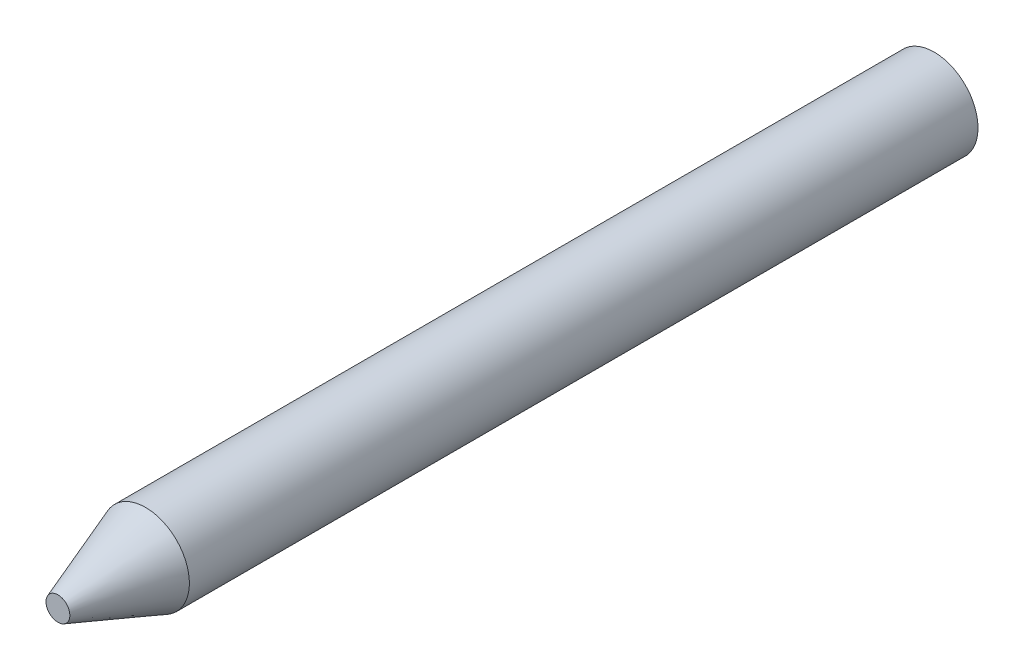
ISO-10303-21;
HEADER;
FILE_DESCRIPTION(('STEP AP214'),'2;1');
FILE_NAME('part.step','',(''),(''),'','','');
FILE_SCHEMA(('AUTOMOTIVE_DESIGN { 1 0 10303 214 1 1 1 1 }'));
ENDSEC;
DATA;
#1=APPLICATION_CONTEXT('core data for automotive mechanical design processes');
#2=APPLICATION_PROTOCOL_DEFINITION('international standard','automotive_design',2000,#1);
#3=PRODUCT_CONTEXT('',#1,'mechanical');
#4=PRODUCT('Part','Part','',(#3));
#5=PRODUCT_RELATED_PRODUCT_CATEGORY('part','',(#4));
#6=PRODUCT_DEFINITION_FORMATION('','',#4);
#7=PRODUCT_DEFINITION_CONTEXT('part definition',#1,'design');
#8=PRODUCT_DEFINITION('design','',#6,#7);
#9=PRODUCT_DEFINITION_SHAPE('','',#8);
#10=(LENGTH_UNIT() NAMED_UNIT(*) SI_UNIT(.MILLI.,.METRE.));
#11=(NAMED_UNIT(*) PLANE_ANGLE_UNIT() SI_UNIT($,.RADIAN.));
#12=(NAMED_UNIT(*) SI_UNIT($,.STERADIAN.) SOLID_ANGLE_UNIT());
#13=UNCERTAINTY_MEASURE_WITH_UNIT(LENGTH_MEASURE(1.E-05),#10,'distance_accuracy_value','');
#14=(GEOMETRIC_REPRESENTATION_CONTEXT(3) GLOBAL_UNCERTAINTY_ASSIGNED_CONTEXT((#13)) GLOBAL_UNIT_ASSIGNED_CONTEXT((#10,
#11,#12)) REPRESENTATION_CONTEXT('',''));
#15=CARTESIAN_POINT('',(0.,0.,0.));
#16=DIRECTION('',(0.,0.,1.));
#17=DIRECTION('',(1.,0.,0.));
#18=AXIS2_PLACEMENT_3D('',#15,#16,#17);
#19=CARTESIAN_POINT('',(0.,0.,70.));
#20=DIRECTION('',(0.,0.,-1.));
#21=DIRECTION('',(-1.,0.,0.));
#22=AXIS2_PLACEMENT_3D('',#19,#20,#21);
#23=CYLINDRICAL_SURFACE('',#22,3.5);
#24=CARTESIAN_POINT('',(0.,0.,62.9999999999999));
#25=DIRECTION('',(0.,0.,1.));
#26=DIRECTION('',(1.,0.,0.));
#27=AXIS2_PLACEMENT_3D('',#24,#25,#26);
#28=CIRCLE('',#27,3.5);
#29=CARTESIAN_POINT('',(-3.5,0.,62.9999999999999));
#30=VERTEX_POINT('',#29);
#31=EDGE_CURVE('E10',#30,#30,#28,.F.);
#32=ORIENTED_EDGE('',*,*,#31,.T.);
#33=EDGE_LOOP('',(#32));
#34=FACE_BOUND('',#33,.T.);
#35=CARTESIAN_POINT('',(0.,0.,0.));
#36=DIRECTION('',(0.,0.,1.));
#37=DIRECTION('',(1.,0.,0.));
#38=AXIS2_PLACEMENT_3D('',#35,#36,#37);
#39=CIRCLE('',#38,3.5);
#40=CARTESIAN_POINT('',(3.5,0.,0.));
#41=VERTEX_POINT('',#40);
#42=EDGE_CURVE('E44',#41,#41,#39,.T.);
#43=ORIENTED_EDGE('',*,*,#42,.T.);
#44=EDGE_LOOP('',(#43));
#45=FACE_BOUND('',#44,.T.);
#46=ADVANCED_FACE('F33',(#34,#45),#23,.T.);
#47=CARTESIAN_POINT('',(0.,0.,70.));
#48=DIRECTION('',(0.,0.,1.));
#49=DIRECTION('',(1.,0.,0.));
#50=AXIS2_PLACEMENT_3D('',#47,#48,#49);
#51=PLANE('',#50);
#52=CARTESIAN_POINT('',(0.,0.,70.));
#53=DIRECTION('',(0.,0.,1.));
#54=DIRECTION('',(1.,0.,0.));
#55=AXIS2_PLACEMENT_3D('',#52,#53,#54);
#56=CIRCLE('',#55,0.952208360136587);
#57=CARTESIAN_POINT('',(-0.95220836013659,0.,70.));
#58=VERTEX_POINT('',#57);
#59=EDGE_CURVE('E40',#58,#58,#56,.T.);
#60=ORIENTED_EDGE('',*,*,#59,.T.);
#61=EDGE_LOOP('',(#60));
#62=FACE_BOUND('',#61,.T.);
#63=ADVANCED_FACE('F54',(#62),#51,.T.);
#64=CARTESIAN_POINT('',(0.,0.,0.));
#65=DIRECTION('',(0.,0.,1.));
#66=DIRECTION('',(1.,0.,0.));
#67=AXIS2_PLACEMENT_3D('',#64,#65,#66);
#68=PLANE('',#67);
#69=ORIENTED_EDGE('',*,*,#42,.F.);
#70=EDGE_LOOP('',(#69));
#71=FACE_BOUND('',#70,.T.);
#72=ADVANCED_FACE('F52',(#71),#68,.F.);
#73=CARTESIAN_POINT('',(0.,0.,70.));
#74=DIRECTION('',(0.,0.,-1.));
#75=DIRECTION('',(-1.,0.,0.));
#76=AXIS2_PLACEMENT_3D('',#73,#74,#75);
#77=CONICAL_SURFACE('',#76,0.952208360136587,0.349065850398863);
#78=CARTESIAN_POINT('',(-3.5,0.,62.9999999999999));
#79=CARTESIAN_POINT('',(-3.47346050375142,0.,63.0729166666666));
#80=CARTESIAN_POINT('',(-3.44692100750285,0.,63.1458333333333));
#81=CARTESIAN_POINT('',(-3.39384201500569,0.,63.2916666666666));
#82=CARTESIAN_POINT('',(-3.36730251875712,0.,63.3645833333333));
#83=CARTESIAN_POINT('',(-3.31422352625996,0.,63.5104166666666));
#84=CARTESIAN_POINT('',(-3.28768403001138,0.,63.5833333333333));
#85=CARTESIAN_POINT('',(-3.23460503751423,0.,63.7291666666666));
#86=CARTESIAN_POINT('',(-3.20806554126565,0.,63.8020833333333));
#87=CARTESIAN_POINT('',(-3.1549865487685,0.,63.9479166666666));
#88=CARTESIAN_POINT('',(-3.12844705251992,0.,64.0208333333333));
#89=CARTESIAN_POINT('',(-3.07536806002277,0.,64.1666666666666));
#90=CARTESIAN_POINT('',(-3.04882856377419,0.,64.2395833333333));
#91=CARTESIAN_POINT('',(-2.99574957127704,0.,64.3854166666666));
#92=CARTESIAN_POINT('',(-2.96921007502846,0.,64.4583333333333));
#93=CARTESIAN_POINT('',(-2.9161310825313,0.,64.6041666666666));
#94=CARTESIAN_POINT('',(-2.88959158628273,0.,64.6770833333333));
#95=CARTESIAN_POINT('',(-2.83651259378557,0.,64.8229166666666));
#96=CARTESIAN_POINT('',(-2.80997309753699,0.,64.8958333333333));
#97=CARTESIAN_POINT('',(-2.75689410503984,0.,65.0416666666666));
#98=CARTESIAN_POINT('',(-2.73035460879126,0.,65.1145833333333));
#99=CARTESIAN_POINT('',(-2.67727561629411,0.,65.2604166666666));
#100=CARTESIAN_POINT('',(-2.65073612004553,0.,65.3333333333333));
#101=CARTESIAN_POINT('',(-2.59765712754838,0.,65.4791666666666));
#102=CARTESIAN_POINT('',(-2.5711176312998,0.,65.5520833333333));
#103=CARTESIAN_POINT('',(-2.51803863880265,0.,65.6979166666666));
#104=CARTESIAN_POINT('',(-2.49149914255407,0.,65.7708333333333));
#105=CARTESIAN_POINT('',(-2.43842015005691,0.,65.9166666666666));
#106=CARTESIAN_POINT('',(-2.41188065380834,0.,65.9895833333333));
#107=CARTESIAN_POINT('',(-2.35880166131118,0.,66.1354166666666));
#108=CARTESIAN_POINT('',(-2.3322621650626,0.,66.2083333333333));
#109=CARTESIAN_POINT('',(-2.27918317256545,0.,66.3541666666666));
#110=CARTESIAN_POINT('',(-2.25264367631687,0.,66.4270833333333));
#111=CARTESIAN_POINT('',(-2.19956468381972,0.,66.5729166666666));
#112=CARTESIAN_POINT('',(-2.17302518757114,0.,66.6458333333333));
#113=CARTESIAN_POINT('',(-2.11994619507399,0.,66.7916666666666));
#114=CARTESIAN_POINT('',(-2.09340669882541,0.,66.8645833333333));
#115=CARTESIAN_POINT('',(-2.04032770632826,0.,67.0104166666666));
#116=CARTESIAN_POINT('',(-2.01378821007968,0.,67.0833333333333));
#117=CARTESIAN_POINT('',(-1.96070921758252,0.,67.2291666666666));
#118=CARTESIAN_POINT('',(-1.93416972133395,0.,67.3020833333333));
#119=CARTESIAN_POINT('',(-1.88109072883679,0.,67.4479166666666));
#120=CARTESIAN_POINT('',(-1.85455123258821,0.,67.5208333333333));
#121=CARTESIAN_POINT('',(-1.80147224009106,0.,67.6666666666667));
#122=CARTESIAN_POINT('',(-1.77493274384248,0.,67.7395833333333));
#123=CARTESIAN_POINT('',(-1.72185375134533,0.,67.8854166666667));
#124=CARTESIAN_POINT('',(-1.69531425509675,0.,67.9583333333333));
#125=CARTESIAN_POINT('',(-1.6422352625996,0.,68.1041666666666));
#126=CARTESIAN_POINT('',(-1.61569576635102,0.,68.1770833333333));
#127=CARTESIAN_POINT('',(-1.56261677385386,0.,68.3229166666666));
#128=CARTESIAN_POINT('',(-1.53607727760529,0.,68.3958333333333));
#129=CARTESIAN_POINT('',(-1.48299828510813,0.,68.5416666666667));
#130=CARTESIAN_POINT('',(-1.45645878885956,0.,68.6145833333333));
#131=CARTESIAN_POINT('',(-1.4033797963624,0.,68.7604166666667));
#132=CARTESIAN_POINT('',(-1.37684030011383,0.,68.8333333333333));
#133=CARTESIAN_POINT('',(-1.32376130761667,0.,68.9791666666667));
#134=CARTESIAN_POINT('',(-1.29722181136809,0.,69.0520833333333));
#135=CARTESIAN_POINT('',(-1.24414281887094,0.,69.1979166666667));
#136=CARTESIAN_POINT('',(-1.21760332262236,0.,69.2708333333333));
#137=CARTESIAN_POINT('',(-1.16452433012521,0.,69.4166666666667));
#138=CARTESIAN_POINT('',(-1.13798483387663,0.,69.4895833333333));
#139=CARTESIAN_POINT('',(-1.08490584137948,0.,69.6354166666667));
#140=CARTESIAN_POINT('',(-1.0583663451309,0.,69.7083333333333));
#141=CARTESIAN_POINT('',(-1.00528735263374,0.,69.8541666666667));
#142=CARTESIAN_POINT('',(-0.978747856385167,0.,69.9270833333333));
#143=CARTESIAN_POINT('',(-0.95220836013659,0.,70.));
#144=B_SPLINE_CURVE_WITH_KNOTS('',3,(#78,#79,#80,#81,#82,#83,#84,#85,#86,#87,#88,#89,#90,#91,
#92,#93,#94,#95,#96,#97,#98,#99,#100,#101,#102,#103,#104,#105,#106,#107,#108,#109,#110,#111,
#112,#113,#114,#115,#116,#117,#118,#119,#120,#121,#122,#123,#124,#125,#126,#127,#128,#129,#130,
#131,#132,#133,#134,#135,#136,#137,#138,#139,#140,#141,#142,#143),.UNSPECIFIED.,.F.,.F.,(4,2,2,
2,2,2,2,2,2,2,2,2,2,2,2,2,2,2,2,2,2,2,2,2,2,2,2,2,2,2,2,2,4),(0.,0.232788887729096,
0.465577775458205,0.698366663187315,0.931155550916424,1.16394443864553,1.39673332637464,
1.62952221410375,1.86231110183285,2.09509998956196,2.32788887729107,2.56067776502018,
2.79346665274928,3.02625554047839,3.2590444282075,3.49183331593661,3.72462220366572,
3.95741109139482,4.19019997912393,4.42298886685304,4.65577775458214,4.88856664231125,
5.12135553004036,5.35414441776947,5.58693330549857,5.81972219322768,6.05251108095679,
6.2852999686859,6.51808885641501,6.75087774414412,6.98366663187322,7.21645551960233,
7.44924440733144),.UNSPECIFIED.);
#145=EDGE_CURVE('BSEAM35',#30,#58,#144,.T.);
#146=ORIENTED_EDGE('',*,*,#31,.F.);
#147=ORIENTED_EDGE('',*,*,#59,.F.);
#148=ORIENTED_EDGE('',*,*,#145,.T.);
#149=ORIENTED_EDGE('',*,*,#145,.F.);
#150=EDGE_LOOP('',(#146,#148,#147,#149));
#151=FACE_BOUND('',#150,.T.);
#152=ADVANCED_FACE('F35',(#151),#77,.T.);
#153=CLOSED_SHELL('',(#46,#63,#72,#152));
#154=MANIFOLD_SOLID_BREP('B2',#153);
#155=ADVANCED_BREP_SHAPE_REPRESENTATION('',(#18,#154),#14);
#156=SHAPE_DEFINITION_REPRESENTATION(#9,#155);
ENDSEC;
END-ISO-10303-21;
